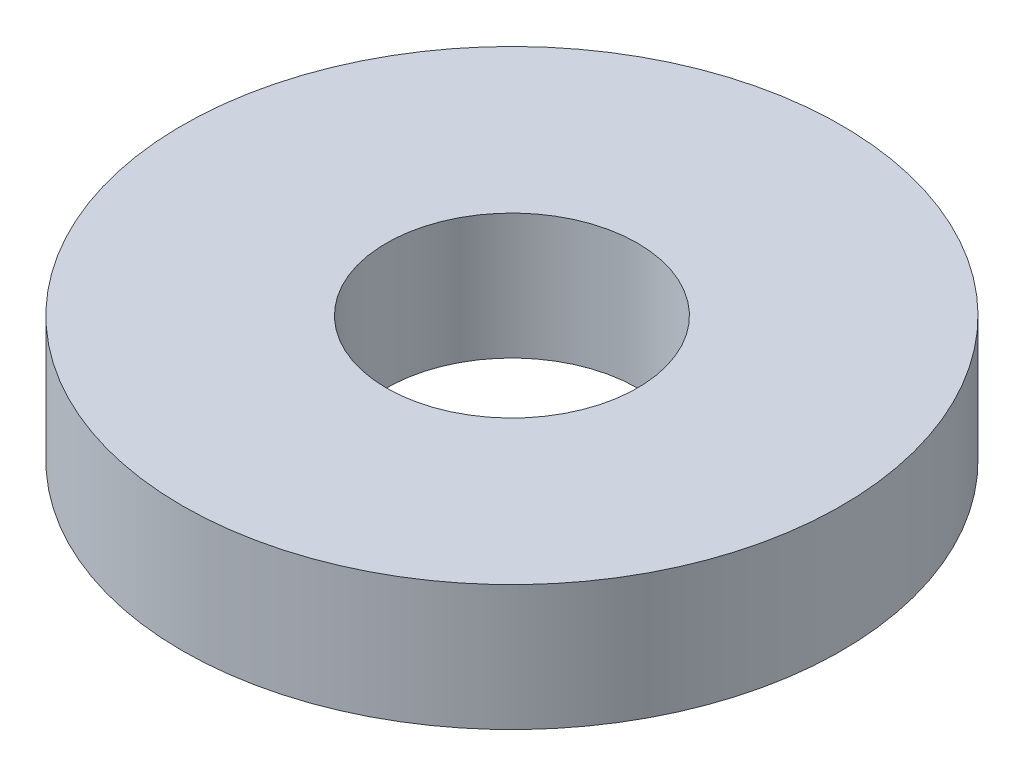
ISO-10303-21;
HEADER;
FILE_DESCRIPTION(('STEP AP214'),'2;1');
FILE_NAME('part.step','',(''),(''),'','','');
FILE_SCHEMA(('AUTOMOTIVE_DESIGN { 1 0 10303 214 1 1 1 1 }'));
ENDSEC;
DATA;
#1=APPLICATION_CONTEXT('core data for automotive mechanical design processes');
#2=APPLICATION_PROTOCOL_DEFINITION('international standard','automotive_design',2000,#1);
#3=PRODUCT_CONTEXT('',#1,'mechanical');
#4=PRODUCT('Part','Part','',(#3));
#5=PRODUCT_RELATED_PRODUCT_CATEGORY('part','',(#4));
#6=PRODUCT_DEFINITION_FORMATION('','',#4);
#7=PRODUCT_DEFINITION_CONTEXT('part definition',#1,'design');
#8=PRODUCT_DEFINITION('design','',#6,#7);
#9=PRODUCT_DEFINITION_SHAPE('','',#8);
#10=(LENGTH_UNIT() NAMED_UNIT(*) SI_UNIT(.MILLI.,.METRE.));
#11=(NAMED_UNIT(*) PLANE_ANGLE_UNIT() SI_UNIT($,.RADIAN.));
#12=(NAMED_UNIT(*) SI_UNIT($,.STERADIAN.) SOLID_ANGLE_UNIT());
#13=UNCERTAINTY_MEASURE_WITH_UNIT(LENGTH_MEASURE(1.E-05),#10,'distance_accuracy_value','');
#14=(GEOMETRIC_REPRESENTATION_CONTEXT(3) GLOBAL_UNCERTAINTY_ASSIGNED_CONTEXT((#13)) GLOBAL_UNIT_ASSIGNED_CONTEXT((#10,
#11,#12)) REPRESENTATION_CONTEXT('',''));
#15=CARTESIAN_POINT('',(0.,0.,0.));
#16=DIRECTION('',(0.,0.,1.));
#17=DIRECTION('',(1.,0.,0.));
#18=AXIS2_PLACEMENT_3D('',#15,#16,#17);
#19=CARTESIAN_POINT('',(0.,4.,0.));
#20=DIRECTION('',(0.,1.,0.));
#21=DIRECTION('',(0.,0.,1.));
#22=AXIS2_PLACEMENT_3D('',#19,#20,#21);
#23=PLANE('',#22);
#24=CARTESIAN_POINT('',(0.,4.,0.));
#25=DIRECTION('',(0.,1.,0.));
#26=DIRECTION('',(0.,0.,1.));
#27=AXIS2_PLACEMENT_3D('',#24,#25,#26);
#28=CIRCLE('',#27,10.5);
#29=CARTESIAN_POINT('',(0.,4.,10.5));
#30=VERTEX_POINT('',#29);
#31=EDGE_CURVE('E10',#30,#30,#28,.T.);
#32=ORIENTED_EDGE('',*,*,#31,.T.);
#33=EDGE_LOOP('',(#32));
#34=FACE_BOUND('',#33,.T.);
#35=CARTESIAN_POINT('',(0.,4.,0.));
#36=DIRECTION('',(0.,1.,0.));
#37=DIRECTION('',(0.,0.,1.));
#38=AXIS2_PLACEMENT_3D('',#35,#36,#37);
#39=CIRCLE('',#38,4.);
#40=CARTESIAN_POINT('',(0.,4.,4.));
#41=VERTEX_POINT('',#40);
#42=EDGE_CURVE('E50',#41,#41,#39,.T.);
#43=ORIENTED_EDGE('',*,*,#42,.F.);
#44=EDGE_LOOP('',(#43));
#45=FACE_BOUND('',#44,.T.);
#46=ADVANCED_FACE('F39',(#34,#45),#23,.T.);
#47=CARTESIAN_POINT('',(0.,0.,0.));
#48=DIRECTION('',(0.,1.,0.));
#49=DIRECTION('',(0.,0.,1.));
#50=AXIS2_PLACEMENT_3D('',#47,#48,#49);
#51=PLANE('',#50);
#52=CARTESIAN_POINT('',(0.,0.,0.));
#53=DIRECTION('',(0.,1.,0.));
#54=DIRECTION('',(0.,0.,1.));
#55=AXIS2_PLACEMENT_3D('',#52,#53,#54);
#56=CIRCLE('',#55,10.5);
#57=CARTESIAN_POINT('',(0.,0.,10.5));
#58=VERTEX_POINT('',#57);
#59=EDGE_CURVE('E43',#58,#58,#56,.T.);
#60=ORIENTED_EDGE('',*,*,#59,.F.);
#61=EDGE_LOOP('',(#60));
#62=FACE_BOUND('',#61,.T.);
#63=CARTESIAN_POINT('',(0.,0.,0.));
#64=DIRECTION('',(0.,1.,0.));
#65=DIRECTION('',(0.,0.,1.));
#66=AXIS2_PLACEMENT_3D('',#63,#64,#65);
#67=CIRCLE('',#66,4.);
#68=CARTESIAN_POINT('',(0.,0.,4.));
#69=VERTEX_POINT('',#68);
#70=EDGE_CURVE('E52',#69,#69,#67,.T.);
#71=ORIENTED_EDGE('',*,*,#70,.T.);
#72=EDGE_LOOP('',(#71));
#73=FACE_BOUND('',#72,.T.);
#74=ADVANCED_FACE('F62',(#62,#73),#51,.F.);
#75=CARTESIAN_POINT('',(0.,4.,0.));
#76=DIRECTION('',(0.,-1.,0.));
#77=DIRECTION('',(0.,0.,-1.));
#78=AXIS2_PLACEMENT_3D('',#75,#76,#77);
#79=CYLINDRICAL_SURFACE('',#78,10.5);
#80=ORIENTED_EDGE('',*,*,#31,.F.);
#81=EDGE_LOOP('',(#80));
#82=FACE_BOUND('',#81,.T.);
#83=ORIENTED_EDGE('',*,*,#59,.T.);
#84=EDGE_LOOP('',(#83));
#85=FACE_BOUND('',#84,.T.);
#86=ADVANCED_FACE('F41',(#82,#85),#79,.T.);
#87=CARTESIAN_POINT('',(0.,4.,0.));
#88=DIRECTION('',(0.,-1.,0.));
#89=DIRECTION('',(0.,0.,-1.));
#90=AXIS2_PLACEMENT_3D('',#87,#88,#89);
#91=CYLINDRICAL_SURFACE('',#90,4.);
#92=ORIENTED_EDGE('',*,*,#42,.T.);
#93=EDGE_LOOP('',(#92));
#94=FACE_BOUND('',#93,.T.);
#95=ORIENTED_EDGE('',*,*,#70,.F.);
#96=EDGE_LOOP('',(#95));
#97=FACE_BOUND('',#96,.T.);
#98=ADVANCED_FACE('F58',(#94,#97),#91,.F.);
#99=CLOSED_SHELL('',(#46,#74,#86,#98));
#100=MANIFOLD_SOLID_BREP('B2',#99);
#101=ADVANCED_BREP_SHAPE_REPRESENTATION('',(#18,#100),#14);
#102=SHAPE_DEFINITION_REPRESENTATION(#9,#101);
ENDSEC;
END-ISO-10303-21;
